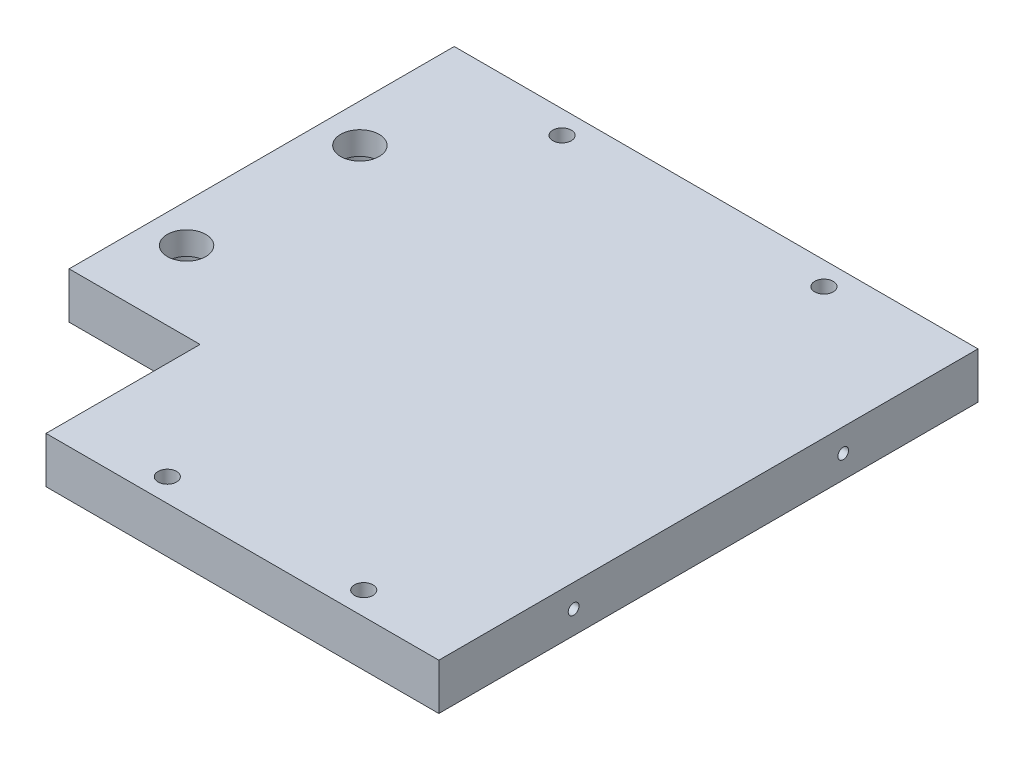
ISO-10303-21;
HEADER;
FILE_DESCRIPTION(('STEP AP214'),'2;1');
FILE_NAME('part.step','',(''),(''),'','','');
FILE_SCHEMA(('AUTOMOTIVE_DESIGN { 1 0 10303 214 1 1 1 1 }'));
ENDSEC;
DATA;
#1=APPLICATION_CONTEXT('core data for automotive mechanical design processes');
#2=APPLICATION_PROTOCOL_DEFINITION('international standard','automotive_design',2000,#1);
#3=PRODUCT_CONTEXT('',#1,'mechanical');
#4=PRODUCT('Part','Part','',(#3));
#5=PRODUCT_RELATED_PRODUCT_CATEGORY('part','',(#4));
#6=PRODUCT_DEFINITION_FORMATION('','',#4);
#7=PRODUCT_DEFINITION_CONTEXT('part definition',#1,'design');
#8=PRODUCT_DEFINITION('design','',#6,#7);
#9=PRODUCT_DEFINITION_SHAPE('','',#8);
#10=(LENGTH_UNIT() NAMED_UNIT(*) SI_UNIT(.MILLI.,.METRE.));
#11=(NAMED_UNIT(*) PLANE_ANGLE_UNIT() SI_UNIT($,.RADIAN.));
#12=(NAMED_UNIT(*) SI_UNIT($,.STERADIAN.) SOLID_ANGLE_UNIT());
#13=UNCERTAINTY_MEASURE_WITH_UNIT(LENGTH_MEASURE(1.E-05),#10,'distance_accuracy_value','');
#14=(GEOMETRIC_REPRESENTATION_CONTEXT(3) GLOBAL_UNCERTAINTY_ASSIGNED_CONTEXT((#13)) GLOBAL_UNIT_ASSIGNED_CONTEXT((#10,
#11,#12)) REPRESENTATION_CONTEXT('',''));
#15=CARTESIAN_POINT('',(0.,0.,0.));
#16=DIRECTION('',(0.,0.,1.));
#17=DIRECTION('',(1.,0.,0.));
#18=AXIS2_PLACEMENT_3D('',#15,#16,#17);
#19=CARTESIAN_POINT('',(-14.4999999978489,3.,-3.87501470179975));
#20=DIRECTION('',(0.,-1.,0.));
#21=DIRECTION('',(0.,0.,-1.));
#22=AXIS2_PLACEMENT_3D('',#19,#20,#21);
#23=CYLINDRICAL_SURFACE('',#22,1.25);
#24=CARTESIAN_POINT('',(-14.4999999978489,3.,-3.87501470179975));
#25=DIRECTION('',(0.,-1.,0.));
#26=DIRECTION('',(0.,0.,-1.));
#27=AXIS2_PLACEMENT_3D('',#24,#25,#26);
#28=CIRCLE('',#27,1.25);
#29=CARTESIAN_POINT('',(-14.4999999978489,3.,-5.12501470179975));
#30=VERTEX_POINT('',#29);
#31=EDGE_CURVE('E107',#30,#30,#28,.T.);
#32=ORIENTED_EDGE('',*,*,#31,.F.);
#33=EDGE_LOOP('',(#32));
#34=FACE_BOUND('',#33,.T.);
#35=CARTESIAN_POINT('',(-14.4999999978489,1.5,-3.87501470179975));
#36=DIRECTION('',(0.,-1.,0.));
#37=DIRECTION('',(0.,0.,-1.));
#38=AXIS2_PLACEMENT_3D('',#35,#36,#37);
#39=CIRCLE('',#38,1.25);
#40=CARTESIAN_POINT('',(-14.4999999978489,1.5,-5.12501470179975));
#41=VERTEX_POINT('',#40);
#42=EDGE_CURVE('E43',#41,#41,#39,.F.);
#43=ORIENTED_EDGE('',*,*,#42,.F.);
#44=EDGE_LOOP('',(#43));
#45=FACE_BOUND('',#44,.T.);
#46=ADVANCED_FACE('F39',(#34,#45),#23,.F.);
#47=CARTESIAN_POINT('',(-8.50000000000002,3.,-11.));
#48=DIRECTION('',(0.,-1.,0.));
#49=DIRECTION('',(0.,0.,-1.));
#50=AXIS2_PLACEMENT_3D('',#47,#48,#49);
#51=CYLINDRICAL_SURFACE('',#50,0.6);
#52=CARTESIAN_POINT('',(-8.50000000000002,3.,-11.));
#53=DIRECTION('',(0.,-1.,0.));
#54=DIRECTION('',(0.,0.,-1.));
#55=AXIS2_PLACEMENT_3D('',#52,#53,#54);
#56=CIRCLE('',#55,0.6);
#57=CARTESIAN_POINT('',(-8.50000000000002,3.,-11.6));
#58=VERTEX_POINT('',#57);
#59=EDGE_CURVE('E130',#58,#58,#56,.T.);
#60=ORIENTED_EDGE('',*,*,#59,.F.);
#61=EDGE_LOOP('',(#60));
#62=FACE_BOUND('',#61,.T.);
#63=CARTESIAN_POINT('',(-8.50000000000002,1.5,-11.));
#64=DIRECTION('',(0.,-1.,0.));
#65=DIRECTION('',(0.,0.,-1.));
#66=AXIS2_PLACEMENT_3D('',#63,#64,#65);
#67=CIRCLE('',#66,0.6);
#68=CARTESIAN_POINT('',(-8.50000000000002,1.5,-11.6));
#69=VERTEX_POINT('',#68);
#70=EDGE_CURVE('E125',#69,#69,#67,.F.);
#71=ORIENTED_EDGE('',*,*,#70,.F.);
#72=EDGE_LOOP('',(#71));
#73=FACE_BOUND('',#72,.T.);
#74=ADVANCED_FACE('F211',(#62,#73),#51,.F.);
#75=CARTESIAN_POINT('',(-14.4999999978489,3.,7.37498529820025));
#76=DIRECTION('',(0.,-1.,0.));
#77=DIRECTION('',(0.,0.,-1.));
#78=AXIS2_PLACEMENT_3D('',#75,#76,#77);
#79=CYLINDRICAL_SURFACE('',#78,1.25);
#80=CARTESIAN_POINT('',(-14.4999999978489,3.,7.37498529820025));
#81=DIRECTION('',(0.,-1.,0.));
#82=DIRECTION('',(0.,0.,-1.));
#83=AXIS2_PLACEMENT_3D('',#80,#81,#82);
#84=CIRCLE('',#83,1.25);
#85=CARTESIAN_POINT('',(-14.4999999978489,3.,6.12498529820025));
#86=VERTEX_POINT('',#85);
#87=EDGE_CURVE('E148',#86,#86,#84,.T.);
#88=ORIENTED_EDGE('',*,*,#87,.F.);
#89=EDGE_LOOP('',(#88));
#90=FACE_BOUND('',#89,.T.);
#91=CARTESIAN_POINT('',(-14.4999999978489,1.5,7.37498529820025));
#92=DIRECTION('',(0.,-1.,0.));
#93=DIRECTION('',(0.,0.,-1.));
#94=AXIS2_PLACEMENT_3D('',#91,#92,#93);
#95=CIRCLE('',#94,1.25);
#96=CARTESIAN_POINT('',(-14.4999999978489,1.5,6.12498529820025));
#97=VERTEX_POINT('',#96);
#98=EDGE_CURVE('E123',#97,#97,#95,.F.);
#99=ORIENTED_EDGE('',*,*,#98,.F.);
#100=EDGE_LOOP('',(#99));
#101=FACE_BOUND('',#100,.T.);
#102=ADVANCED_FACE('F218',(#90,#101),#79,.F.);
#103=CARTESIAN_POINT('',(10.625,3.,21.));
#104=DIRECTION('',(0.,-1.,0.));
#105=DIRECTION('',(0.,0.,-1.));
#106=AXIS2_PLACEMENT_3D('',#103,#104,#105);
#107=CYLINDRICAL_SURFACE('',#106,0.6);
#108=CARTESIAN_POINT('',(10.625,3.,21.));
#109=DIRECTION('',(0.,-1.,0.));
#110=DIRECTION('',(0.,0.,-1.));
#111=AXIS2_PLACEMENT_3D('',#108,#109,#110);
#112=CIRCLE('',#111,0.6);
#113=CARTESIAN_POINT('',(10.625,3.,20.4));
#114=VERTEX_POINT('',#113);
#115=EDGE_CURVE('E146',#114,#114,#112,.T.);
#116=ORIENTED_EDGE('',*,*,#115,.F.);
#117=EDGE_LOOP('',(#116));
#118=FACE_BOUND('',#117,.T.);
#119=CARTESIAN_POINT('',(10.625,1.5,21.));
#120=DIRECTION('',(0.,-1.,0.));
#121=DIRECTION('',(0.,0.,-1.));
#122=AXIS2_PLACEMENT_3D('',#119,#120,#121);
#123=CIRCLE('',#122,0.6);
#124=CARTESIAN_POINT('',(10.625,1.5,20.4));
#125=VERTEX_POINT('',#124);
#126=EDGE_CURVE('E120',#125,#125,#123,.F.);
#127=ORIENTED_EDGE('',*,*,#126,.F.);
#128=EDGE_LOOP('',(#127));
#129=FACE_BOUND('',#128,.T.);
#130=ADVANCED_FACE('F224',(#118,#129),#107,.F.);
#131=CARTESIAN_POINT('',(-2.125,3.,21.));
#132=DIRECTION('',(0.,-1.,0.));
#133=DIRECTION('',(0.,0.,-1.));
#134=AXIS2_PLACEMENT_3D('',#131,#132,#133);
#135=CYLINDRICAL_SURFACE('',#134,0.6);
#136=CARTESIAN_POINT('',(-2.125,3.,21.));
#137=DIRECTION('',(0.,-1.,0.));
#138=DIRECTION('',(0.,0.,-1.));
#139=AXIS2_PLACEMENT_3D('',#136,#137,#138);
#140=CIRCLE('',#139,0.6);
#141=CARTESIAN_POINT('',(-2.125,3.,20.4));
#142=VERTEX_POINT('',#141);
#143=EDGE_CURVE('E139',#142,#142,#140,.T.);
#144=ORIENTED_EDGE('',*,*,#143,.F.);
#145=EDGE_LOOP('',(#144));
#146=FACE_BOUND('',#145,.T.);
#147=CARTESIAN_POINT('',(-2.125,1.5,21.));
#148=DIRECTION('',(0.,-1.,0.));
#149=DIRECTION('',(0.,0.,-1.));
#150=AXIS2_PLACEMENT_3D('',#147,#148,#149);
#151=CIRCLE('',#150,0.6);
#152=CARTESIAN_POINT('',(-2.125,1.5,20.4));
#153=VERTEX_POINT('',#152);
#154=EDGE_CURVE('E116',#153,#153,#151,.F.);
#155=ORIENTED_EDGE('',*,*,#154,.F.);
#156=EDGE_LOOP('',(#155));
#157=FACE_BOUND('',#156,.T.);
#158=ADVANCED_FACE('F237',(#146,#157),#135,.F.);
#159=CARTESIAN_POINT('',(8.49999999999999,3.,-11.));
#160=DIRECTION('',(0.,-1.,0.));
#161=DIRECTION('',(0.,0.,-1.));
#162=AXIS2_PLACEMENT_3D('',#159,#160,#161);
#163=CYLINDRICAL_SURFACE('',#162,0.6);
#164=CARTESIAN_POINT('',(8.49999999999999,3.,-11.));
#165=DIRECTION('',(0.,-1.,0.));
#166=DIRECTION('',(0.,0.,-1.));
#167=AXIS2_PLACEMENT_3D('',#164,#165,#166);
#168=CIRCLE('',#167,0.6);
#169=CARTESIAN_POINT('',(8.49999999999999,3.,-11.6));
#170=VERTEX_POINT('',#169);
#171=EDGE_CURVE('E134',#170,#170,#168,.T.);
#172=ORIENTED_EDGE('',*,*,#171,.F.);
#173=EDGE_LOOP('',(#172));
#174=FACE_BOUND('',#173,.T.);
#175=CARTESIAN_POINT('',(8.49999999999999,1.5,-11.));
#176=DIRECTION('',(0.,-1.,0.));
#177=DIRECTION('',(0.,0.,-1.));
#178=AXIS2_PLACEMENT_3D('',#175,#176,#177);
#179=CIRCLE('',#178,0.6);
#180=CARTESIAN_POINT('',(8.49999999999999,1.5,-11.6));
#181=VERTEX_POINT('',#180);
#182=EDGE_CURVE('E113',#181,#181,#179,.F.);
#183=ORIENTED_EDGE('',*,*,#182,.F.);
#184=EDGE_LOOP('',(#183));
#185=FACE_BOUND('',#184,.T.);
#186=ADVANCED_FACE('F232',(#174,#185),#163,.F.);
#187=CARTESIAN_POINT('',(-17.,3.,12.5));
#188=DIRECTION('',(0.,0.,-1.));
#189=DIRECTION('',(-1.,0.,0.));
#190=AXIS2_PLACEMENT_3D('',#187,#188,#189);
#191=PLANE('',#190);
#192=DIRECTION('',(0.,-1.,0.));
#193=VECTOR('',#192,1.);
#194=CARTESIAN_POINT('',(-8.5,3.,12.5));
#195=LINE('',#194,#193);
#196=CARTESIAN_POINT('',(-8.5,3.,12.5));
#197=VERTEX_POINT('',#196);
#198=CARTESIAN_POINT('',(-8.5,0.,12.5));
#199=VERTEX_POINT('',#198);
#200=EDGE_CURVE('E11',#197,#199,#195,.T.);
#201=ORIENTED_EDGE('',*,*,#200,.F.);
#202=DIRECTION('',(1.,0.,0.));
#203=VECTOR('',#202,1.);
#204=CARTESIAN_POINT('',(-17.,3.,12.5));
#205=LINE('',#204,#203);
#206=CARTESIAN_POINT('',(-17.,3.,12.5));
#207=VERTEX_POINT('',#206);
#208=EDGE_CURVE('E162',#207,#197,#205,.T.);
#209=ORIENTED_EDGE('',*,*,#208,.F.);
#210=DIRECTION('',(0.,-1.,0.));
#211=VECTOR('',#210,1.);
#212=CARTESIAN_POINT('',(-17.,3.,12.5));
#213=LINE('',#212,#211);
#214=CARTESIAN_POINT('',(-17.,0.,12.5));
#215=VERTEX_POINT('',#214);
#216=EDGE_CURVE('E49',#207,#215,#213,.T.);
#217=ORIENTED_EDGE('',*,*,#216,.T.);
#218=DIRECTION('',(1.,0.,0.));
#219=VECTOR('',#218,1.);
#220=CARTESIAN_POINT('',(-17.,0.,12.5));
#221=LINE('',#220,#219);
#222=EDGE_CURVE('E92',#215,#199,#221,.T.);
#223=ORIENTED_EDGE('',*,*,#222,.T.);
#224=EDGE_LOOP('',(#201,#209,#217,#223));
#225=FACE_BOUND('',#224,.T.);
#226=ADVANCED_FACE('F184',(#225),#191,.F.);
#227=CARTESIAN_POINT('',(-17.,3.,12.5));
#228=DIRECTION('',(-1.,0.,0.));
#229=DIRECTION('',(0.,0.,1.));
#230=AXIS2_PLACEMENT_3D('',#227,#228,#229);
#231=PLANE('',#230);
#232=DIRECTION('',(0.,0.,-1.));
#233=VECTOR('',#232,1.);
#234=CARTESIAN_POINT('',(-17.,0.,12.5));
#235=LINE('',#234,#233);
#236=CARTESIAN_POINT('',(-17.,0.,-12.5));
#237=VERTEX_POINT('',#236);
#238=EDGE_CURVE('E111',#215,#237,#235,.T.);
#239=ORIENTED_EDGE('',*,*,#238,.F.);
#240=ORIENTED_EDGE('',*,*,#216,.F.);
#241=DIRECTION('',(0.,0.,-1.));
#242=VECTOR('',#241,1.);
#243=CARTESIAN_POINT('',(-17.,3.,12.5));
#244=LINE('',#243,#242);
#245=CARTESIAN_POINT('',(-17.,3.,-12.5));
#246=VERTEX_POINT('',#245);
#247=EDGE_CURVE('E155',#207,#246,#244,.T.);
#248=ORIENTED_EDGE('',*,*,#247,.T.);
#249=DIRECTION('',(0.,-1.,0.));
#250=VECTOR('',#249,1.);
#251=CARTESIAN_POINT('',(-17.,3.,-12.5));
#252=LINE('',#251,#250);
#253=EDGE_CURVE('E165',#246,#237,#252,.T.);
#254=ORIENTED_EDGE('',*,*,#253,.T.);
#255=EDGE_LOOP('',(#239,#240,#248,#254));
#256=FACE_BOUND('',#255,.T.);
#257=ADVANCED_FACE('F188',(#256),#231,.T.);
#258=CARTESIAN_POINT('',(17.,3.,12.5));
#259=DIRECTION('',(-1.,0.,0.));
#260=DIRECTION('',(0.,0.,1.));
#261=AXIS2_PLACEMENT_3D('',#258,#259,#260);
#262=PLANE('',#261);
#263=CARTESIAN_POINT('',(17.,1.49999999999993,-3.74999999999997));
#264=DIRECTION('',(1.,0.,0.));
#265=DIRECTION('',(0.,0.,-1.));
#266=AXIS2_PLACEMENT_3D('',#263,#264,#265);
#267=CIRCLE('',#266,0.35);
#268=CARTESIAN_POINT('',(17.,1.49999999999993,-4.09999999999997));
#269=VERTEX_POINT('',#268);
#270=EDGE_CURVE('E563',#269,#269,#267,.T.);
#271=ORIENTED_EDGE('',*,*,#270,.F.);
#272=EDGE_LOOP('',(#271));
#273=FACE_BOUND('',#272,.T.);
#274=CARTESIAN_POINT('',(17.,1.49999999999993,13.75));
#275=DIRECTION('',(1.,0.,0.));
#276=DIRECTION('',(0.,0.,-1.));
#277=AXIS2_PLACEMENT_3D('',#274,#275,#276);
#278=CIRCLE('',#277,0.349999999999999);
#279=CARTESIAN_POINT('',(17.,1.49999999999993,13.4));
#280=VERTEX_POINT('',#279);
#281=EDGE_CURVE('E569',#280,#280,#278,.T.);
#282=ORIENTED_EDGE('',*,*,#281,.F.);
#283=EDGE_LOOP('',(#282));
#284=FACE_BOUND('',#283,.T.);
#285=DIRECTION('',(0.,0.,-1.));
#286=VECTOR('',#285,1.);
#287=CARTESIAN_POINT('',(17.,0.,12.5));
#288=LINE('',#287,#286);
#289=CARTESIAN_POINT('',(17.,0.,22.5));
#290=VERTEX_POINT('',#289);
#291=CARTESIAN_POINT('',(17.,0.,-12.5));
#292=VERTEX_POINT('',#291);
#293=EDGE_CURVE('E81',#290,#292,#288,.T.);
#294=ORIENTED_EDGE('',*,*,#293,.T.);
#295=DIRECTION('',(0.,-1.,0.));
#296=VECTOR('',#295,1.);
#297=CARTESIAN_POINT('',(17.,3.,-12.5));
#298=LINE('',#297,#296);
#299=CARTESIAN_POINT('',(17.,3.,-12.5));
#300=VERTEX_POINT('',#299);
#301=EDGE_CURVE('E171',#300,#292,#298,.T.);
#302=ORIENTED_EDGE('',*,*,#301,.F.);
#303=DIRECTION('',(0.,0.,-1.));
#304=VECTOR('',#303,1.);
#305=CARTESIAN_POINT('',(17.,3.,12.5));
#306=LINE('',#305,#304);
#307=CARTESIAN_POINT('',(17.,3.,22.5));
#308=VERTEX_POINT('',#307);
#309=EDGE_CURVE('E98',#308,#300,#306,.T.);
#310=ORIENTED_EDGE('',*,*,#309,.F.);
#311=DIRECTION('',(0.,-1.,0.));
#312=VECTOR('',#311,1.);
#313=CARTESIAN_POINT('',(17.,3.,22.5));
#314=LINE('',#313,#312);
#315=EDGE_CURVE('E95',#308,#290,#314,.T.);
#316=ORIENTED_EDGE('',*,*,#315,.T.);
#317=EDGE_LOOP('',(#294,#302,#310,#316));
#318=FACE_BOUND('',#317,.T.);
#319=ADVANCED_FACE('F96',(#273,#284,#318),#262,.F.);
#320=CARTESIAN_POINT('',(-17.,3.,-12.5));
#321=DIRECTION('',(0.,0.,-1.));
#322=DIRECTION('',(-1.,0.,0.));
#323=AXIS2_PLACEMENT_3D('',#320,#321,#322);
#324=PLANE('',#323);
#325=DIRECTION('',(1.,0.,0.));
#326=VECTOR('',#325,1.);
#327=CARTESIAN_POINT('',(-17.,0.,-12.5));
#328=LINE('',#327,#326);
#329=EDGE_CURVE('E89',#237,#292,#328,.T.);
#330=ORIENTED_EDGE('',*,*,#329,.F.);
#331=ORIENTED_EDGE('',*,*,#253,.F.);
#332=DIRECTION('',(1.,0.,0.));
#333=VECTOR('',#332,1.);
#334=CARTESIAN_POINT('',(-17.,3.,-12.5));
#335=LINE('',#334,#333);
#336=EDGE_CURVE('E158',#246,#300,#335,.T.);
#337=ORIENTED_EDGE('',*,*,#336,.T.);
#338=ORIENTED_EDGE('',*,*,#301,.T.);
#339=EDGE_LOOP('',(#330,#331,#337,#338));
#340=FACE_BOUND('',#339,.T.);
#341=ADVANCED_FACE('F195',(#340),#324,.T.);
#342=CARTESIAN_POINT('',(0.,3.,0.));
#343=DIRECTION('',(0.,-1.,0.));
#344=DIRECTION('',(0.,0.,-1.));
#345=AXIS2_PLACEMENT_3D('',#342,#343,#344);
#346=PLANE('',#345);
#347=ORIENTED_EDGE('',*,*,#171,.T.);
#348=EDGE_LOOP('',(#347));
#349=FACE_BOUND('',#348,.T.);
#350=ORIENTED_EDGE('',*,*,#143,.T.);
#351=EDGE_LOOP('',(#350));
#352=FACE_BOUND('',#351,.T.);
#353=ORIENTED_EDGE('',*,*,#115,.T.);
#354=EDGE_LOOP('',(#353));
#355=FACE_BOUND('',#354,.T.);
#356=ORIENTED_EDGE('',*,*,#87,.T.);
#357=EDGE_LOOP('',(#356));
#358=FACE_BOUND('',#357,.T.);
#359=ORIENTED_EDGE('',*,*,#59,.T.);
#360=EDGE_LOOP('',(#359));
#361=FACE_BOUND('',#360,.T.);
#362=ORIENTED_EDGE('',*,*,#31,.T.);
#363=EDGE_LOOP('',(#362));
#364=FACE_BOUND('',#363,.T.);
#365=ORIENTED_EDGE('',*,*,#247,.F.);
#366=ORIENTED_EDGE('',*,*,#208,.T.);
#367=DIRECTION('',(0.,0.,1.));
#368=VECTOR('',#367,1.);
#369=CARTESIAN_POINT('',(-8.5,3.,12.5));
#370=LINE('',#369,#368);
#371=CARTESIAN_POINT('',(-8.5,3.,22.5));
#372=VERTEX_POINT('',#371);
#373=EDGE_CURVE('E103',#197,#372,#370,.T.);
#374=ORIENTED_EDGE('',*,*,#373,.T.);
#375=DIRECTION('',(-1.,0.,0.));
#376=VECTOR('',#375,1.);
#377=CARTESIAN_POINT('',(17.,3.,22.5));
#378=LINE('',#377,#376);
#379=EDGE_CURVE('E100',#308,#372,#378,.T.);
#380=ORIENTED_EDGE('',*,*,#379,.F.);
#381=ORIENTED_EDGE('',*,*,#309,.T.);
#382=ORIENTED_EDGE('',*,*,#336,.F.);
#383=EDGE_LOOP('',(#365,#366,#374,#380,#381,#382));
#384=FACE_BOUND('',#383,.T.);
#385=ADVANCED_FACE('F177',(#349,#352,#355,#358,#361,#364,#384),#346,.F.);
#386=CARTESIAN_POINT('',(0.,0.,0.));
#387=DIRECTION('',(0.,-1.,0.));
#388=DIRECTION('',(0.,0.,-1.));
#389=AXIS2_PLACEMENT_3D('',#386,#387,#388);
#390=PLANE('',#389);
#391=CARTESIAN_POINT('',(8.49999999999999,0.,-11.));
#392=DIRECTION('',(0.,-1.,0.));
#393=DIRECTION('',(0.,0.,-1.));
#394=AXIS2_PLACEMENT_3D('',#391,#392,#393);
#395=CIRCLE('',#394,0.999999999999999);
#396=CARTESIAN_POINT('',(8.49999999999999,0.,-12.));
#397=VERTEX_POINT('',#396);
#398=EDGE_CURVE('E587',#397,#397,#395,.T.);
#399=ORIENTED_EDGE('',*,*,#398,.F.);
#400=EDGE_LOOP('',(#399));
#401=FACE_BOUND('',#400,.T.);
#402=CARTESIAN_POINT('',(-2.125,0.,21.));
#403=DIRECTION('',(0.,-1.,0.));
#404=DIRECTION('',(0.,0.,-1.));
#405=AXIS2_PLACEMENT_3D('',#402,#403,#404);
#406=CIRCLE('',#405,1.);
#407=CARTESIAN_POINT('',(-2.125,0.,20.));
#408=VERTEX_POINT('',#407);
#409=EDGE_CURVE('E580',#408,#408,#406,.T.);
#410=ORIENTED_EDGE('',*,*,#409,.F.);
#411=EDGE_LOOP('',(#410));
#412=FACE_BOUND('',#411,.T.);
#413=CARTESIAN_POINT('',(10.625,0.,21.));
#414=DIRECTION('',(0.,-1.,0.));
#415=DIRECTION('',(0.,0.,-1.));
#416=AXIS2_PLACEMENT_3D('',#413,#414,#415);
#417=CIRCLE('',#416,1.);
#418=CARTESIAN_POINT('',(10.625,0.,20.));
#419=VERTEX_POINT('',#418);
#420=EDGE_CURVE('E597',#419,#419,#417,.T.);
#421=ORIENTED_EDGE('',*,*,#420,.F.);
#422=EDGE_LOOP('',(#421));
#423=FACE_BOUND('',#422,.T.);
#424=CARTESIAN_POINT('',(-14.4999999978489,0.,-3.87501470179975));
#425=DIRECTION('',(0.,-1.,0.));
#426=DIRECTION('',(0.,0.,-1.));
#427=AXIS2_PLACEMENT_3D('',#424,#425,#426);
#428=CIRCLE('',#427,2.);
#429=CARTESIAN_POINT('',(-14.4999999978489,0.,-5.87501470179975));
#430=VERTEX_POINT('',#429);
#431=EDGE_CURVE('E591',#430,#430,#428,.T.);
#432=ORIENTED_EDGE('',*,*,#431,.F.);
#433=EDGE_LOOP('',(#432));
#434=FACE_BOUND('',#433,.T.);
#435=CARTESIAN_POINT('',(-8.50000000000002,0.,-11.));
#436=DIRECTION('',(0.,-1.,0.));
#437=DIRECTION('',(0.,0.,-1.));
#438=AXIS2_PLACEMENT_3D('',#435,#436,#437);
#439=CIRCLE('',#438,1.);
#440=CARTESIAN_POINT('',(-8.50000000000002,0.,-12.));
#441=VERTEX_POINT('',#440);
#442=EDGE_CURVE('E566',#441,#441,#439,.T.);
#443=ORIENTED_EDGE('',*,*,#442,.F.);
#444=EDGE_LOOP('',(#443));
#445=FACE_BOUND('',#444,.T.);
#446=CARTESIAN_POINT('',(-14.4999999978489,0.,7.37498529820025));
#447=DIRECTION('',(0.,-1.,0.));
#448=DIRECTION('',(0.,0.,-1.));
#449=AXIS2_PLACEMENT_3D('',#446,#447,#448);
#450=CIRCLE('',#449,2.);
#451=CARTESIAN_POINT('',(-14.4999999978489,0.,5.37498529820025));
#452=VERTEX_POINT('',#451);
#453=EDGE_CURVE('E143',#452,#452,#450,.T.);
#454=ORIENTED_EDGE('',*,*,#453,.F.);
#455=EDGE_LOOP('',(#454));
#456=FACE_BOUND('',#455,.T.);
#457=ORIENTED_EDGE('',*,*,#238,.T.);
#458=ORIENTED_EDGE('',*,*,#329,.T.);
#459=ORIENTED_EDGE('',*,*,#293,.F.);
#460=DIRECTION('',(-1.,0.,0.));
#461=VECTOR('',#460,1.);
#462=CARTESIAN_POINT('',(17.,0.,22.5));
#463=LINE('',#462,#461);
#464=CARTESIAN_POINT('',(-8.5,0.,22.5));
#465=VERTEX_POINT('',#464);
#466=EDGE_CURVE('E86',#290,#465,#463,.T.);
#467=ORIENTED_EDGE('',*,*,#466,.T.);
#468=DIRECTION('',(0.,0.,1.));
#469=VECTOR('',#468,1.);
#470=CARTESIAN_POINT('',(-8.5,0.,12.5));
#471=LINE('',#470,#469);
#472=EDGE_CURVE('E104',#199,#465,#471,.T.);
#473=ORIENTED_EDGE('',*,*,#472,.F.);
#474=ORIENTED_EDGE('',*,*,#222,.F.);
#475=EDGE_LOOP('',(#457,#458,#459,#467,#473,#474));
#476=FACE_BOUND('',#475,.T.);
#477=ADVANCED_FACE('F84',(#401,#412,#423,#434,#445,#456,#476),#390,.T.);
#478=CARTESIAN_POINT('',(17.,3.,22.5));
#479=DIRECTION('',(0.,0.,1.));
#480=DIRECTION('',(1.,0.,0.));
#481=AXIS2_PLACEMENT_3D('',#478,#479,#480);
#482=PLANE('',#481);
#483=ORIENTED_EDGE('',*,*,#466,.F.);
#484=ORIENTED_EDGE('',*,*,#315,.F.);
#485=ORIENTED_EDGE('',*,*,#379,.T.);
#486=DIRECTION('',(0.,-1.,0.));
#487=VECTOR('',#486,1.);
#488=CARTESIAN_POINT('',(-8.5,3.,22.5));
#489=LINE('',#488,#487);
#490=EDGE_CURVE('E74',#372,#465,#489,.T.);
#491=ORIENTED_EDGE('',*,*,#490,.T.);
#492=EDGE_LOOP('',(#483,#484,#485,#491));
#493=FACE_BOUND('',#492,.T.);
#494=ADVANCED_FACE('F102',(#493),#482,.T.);
#495=CARTESIAN_POINT('',(-8.5,3.,12.5));
#496=DIRECTION('',(1.,0.,0.));
#497=DIRECTION('',(0.,0.,-1.));
#498=AXIS2_PLACEMENT_3D('',#495,#496,#497);
#499=PLANE('',#498);
#500=ORIENTED_EDGE('',*,*,#472,.T.);
#501=ORIENTED_EDGE('',*,*,#490,.F.);
#502=ORIENTED_EDGE('',*,*,#373,.F.);
#503=ORIENTED_EDGE('',*,*,#200,.T.);
#504=EDGE_LOOP('',(#500,#501,#502,#503));
#505=FACE_BOUND('',#504,.T.);
#506=ADVANCED_FACE('F41',(#505),#499,.F.);
#507=CARTESIAN_POINT('',(8.49999999999999,1.5,-11.));
#508=DIRECTION('',(0.,-1.,0.));
#509=DIRECTION('',(0.,0.,-1.));
#510=AXIS2_PLACEMENT_3D('',#507,#508,#509);
#511=PLANE('',#510);
#512=CARTESIAN_POINT('',(8.49999999999999,1.5,-11.));
#513=DIRECTION('',(0.,-1.,0.));
#514=DIRECTION('',(0.,0.,-1.));
#515=AXIS2_PLACEMENT_3D('',#512,#513,#514);
#516=CIRCLE('',#515,0.999999999999999);
#517=CARTESIAN_POINT('',(8.49999999999999,1.5,-12.));
#518=VERTEX_POINT('',#517);
#519=EDGE_CURVE('E578',#518,#518,#516,.T.);
#520=ORIENTED_EDGE('',*,*,#519,.T.);
#521=EDGE_LOOP('',(#520));
#522=FACE_BOUND('',#521,.T.);
#523=ORIENTED_EDGE('',*,*,#182,.T.);
#524=EDGE_LOOP('',(#523));
#525=FACE_BOUND('',#524,.T.);
#526=ADVANCED_FACE('F230',(#522,#525),#511,.T.);
#527=CARTESIAN_POINT('',(8.49999999999999,1.5,-11.));
#528=DIRECTION('',(0.,-1.,0.));
#529=DIRECTION('',(0.,0.,-1.));
#530=AXIS2_PLACEMENT_3D('',#527,#528,#529);
#531=CYLINDRICAL_SURFACE('',#530,0.999999999999999);
#532=ORIENTED_EDGE('',*,*,#519,.F.);
#533=EDGE_LOOP('',(#532));
#534=FACE_BOUND('',#533,.T.);
#535=ORIENTED_EDGE('',*,*,#398,.T.);
#536=EDGE_LOOP('',(#535));
#537=FACE_BOUND('',#536,.T.);
#538=ADVANCED_FACE('F247',(#534,#537),#531,.F.);
#539=CARTESIAN_POINT('',(-2.125,1.5,21.));
#540=DIRECTION('',(0.,-1.,0.));
#541=DIRECTION('',(0.,0.,-1.));
#542=AXIS2_PLACEMENT_3D('',#539,#540,#541);
#543=PLANE('',#542);
#544=CARTESIAN_POINT('',(-2.125,1.5,21.));
#545=DIRECTION('',(0.,-1.,0.));
#546=DIRECTION('',(0.,0.,-1.));
#547=AXIS2_PLACEMENT_3D('',#544,#545,#546);
#548=CIRCLE('',#547,1.);
#549=CARTESIAN_POINT('',(-2.125,1.5,20.));
#550=VERTEX_POINT('',#549);
#551=EDGE_CURVE('E584',#550,#550,#548,.T.);
#552=ORIENTED_EDGE('',*,*,#551,.T.);
#553=EDGE_LOOP('',(#552));
#554=FACE_BOUND('',#553,.T.);
#555=ORIENTED_EDGE('',*,*,#154,.T.);
#556=EDGE_LOOP('',(#555));
#557=FACE_BOUND('',#556,.T.);
#558=ADVANCED_FACE('F253',(#554,#557),#543,.T.);
#559=CARTESIAN_POINT('',(-2.125,1.5,21.));
#560=DIRECTION('',(0.,-1.,0.));
#561=DIRECTION('',(0.,0.,-1.));
#562=AXIS2_PLACEMENT_3D('',#559,#560,#561);
#563=CYLINDRICAL_SURFACE('',#562,1.);
#564=ORIENTED_EDGE('',*,*,#551,.F.);
#565=EDGE_LOOP('',(#564));
#566=FACE_BOUND('',#565,.T.);
#567=ORIENTED_EDGE('',*,*,#409,.T.);
#568=EDGE_LOOP('',(#567));
#569=FACE_BOUND('',#568,.T.);
#570=ADVANCED_FACE('F278',(#566,#569),#563,.F.);
#571=CARTESIAN_POINT('',(10.625,1.5,21.));
#572=DIRECTION('',(0.,-1.,0.));
#573=DIRECTION('',(0.,0.,-1.));
#574=AXIS2_PLACEMENT_3D('',#571,#572,#573);
#575=PLANE('',#574);
#576=CARTESIAN_POINT('',(10.625,1.5,21.));
#577=DIRECTION('',(0.,-1.,0.));
#578=DIRECTION('',(0.,0.,-1.));
#579=AXIS2_PLACEMENT_3D('',#576,#577,#578);
#580=CIRCLE('',#579,1.);
#581=CARTESIAN_POINT('',(10.625,1.5,20.));
#582=VERTEX_POINT('',#581);
#583=EDGE_CURVE('E583',#582,#582,#580,.T.);
#584=ORIENTED_EDGE('',*,*,#583,.T.);
#585=EDGE_LOOP('',(#584));
#586=FACE_BOUND('',#585,.T.);
#587=ORIENTED_EDGE('',*,*,#126,.T.);
#588=EDGE_LOOP('',(#587));
#589=FACE_BOUND('',#588,.T.);
#590=ADVANCED_FACE('F274',(#586,#589),#575,.T.);
#591=CARTESIAN_POINT('',(10.625,1.5,21.));
#592=DIRECTION('',(0.,-1.,0.));
#593=DIRECTION('',(0.,0.,-1.));
#594=AXIS2_PLACEMENT_3D('',#591,#592,#593);
#595=CYLINDRICAL_SURFACE('',#594,1.);
#596=ORIENTED_EDGE('',*,*,#583,.F.);
#597=EDGE_LOOP('',(#596));
#598=FACE_BOUND('',#597,.T.);
#599=ORIENTED_EDGE('',*,*,#420,.T.);
#600=EDGE_LOOP('',(#599));
#601=FACE_BOUND('',#600,.T.);
#602=ADVANCED_FACE('F270',(#598,#601),#595,.F.);
#603=CARTESIAN_POINT('',(-14.4999999978489,1.5,7.37498529820025));
#604=DIRECTION('',(0.,-1.,0.));
#605=DIRECTION('',(0.,0.,-1.));
#606=AXIS2_PLACEMENT_3D('',#603,#604,#605);
#607=PLANE('',#606);
#608=CARTESIAN_POINT('',(-14.4999999978489,1.5,7.37498529820025));
#609=DIRECTION('',(0.,-1.,0.));
#610=DIRECTION('',(0.,0.,-1.));
#611=AXIS2_PLACEMENT_3D('',#608,#609,#610);
#612=CIRCLE('',#611,2.);
#613=CARTESIAN_POINT('',(-14.4999999978489,1.5,5.37498529820025));
#614=VERTEX_POINT('',#613);
#615=EDGE_CURVE('E117',#614,#614,#612,.T.);
#616=ORIENTED_EDGE('',*,*,#615,.T.);
#617=EDGE_LOOP('',(#616));
#618=FACE_BOUND('',#617,.T.);
#619=ORIENTED_EDGE('',*,*,#98,.T.);
#620=EDGE_LOOP('',(#619));
#621=FACE_BOUND('',#620,.T.);
#622=ADVANCED_FACE('F273',(#618,#621),#607,.T.);
#623=CARTESIAN_POINT('',(-14.4999999978489,1.5,7.37498529820025));
#624=DIRECTION('',(0.,-1.,0.));
#625=DIRECTION('',(0.,0.,-1.));
#626=AXIS2_PLACEMENT_3D('',#623,#624,#625);
#627=CYLINDRICAL_SURFACE('',#626,2.);
#628=ORIENTED_EDGE('',*,*,#615,.F.);
#629=EDGE_LOOP('',(#628));
#630=FACE_BOUND('',#629,.T.);
#631=ORIENTED_EDGE('',*,*,#453,.T.);
#632=EDGE_LOOP('',(#631));
#633=FACE_BOUND('',#632,.T.);
#634=ADVANCED_FACE('F282',(#630,#633),#627,.F.);
#635=CARTESIAN_POINT('',(-8.50000000000002,1.5,-11.));
#636=DIRECTION('',(0.,-1.,0.));
#637=DIRECTION('',(0.,0.,-1.));
#638=AXIS2_PLACEMENT_3D('',#635,#636,#637);
#639=PLANE('',#638);
#640=CARTESIAN_POINT('',(-8.50000000000002,1.5,-11.));
#641=DIRECTION('',(0.,-1.,0.));
#642=DIRECTION('',(0.,0.,-1.));
#643=AXIS2_PLACEMENT_3D('',#640,#641,#642);
#644=CIRCLE('',#643,1.);
#645=CARTESIAN_POINT('',(-8.50000000000002,1.5,-12.));
#646=VERTEX_POINT('',#645);
#647=EDGE_CURVE('E562',#646,#646,#644,.T.);
#648=ORIENTED_EDGE('',*,*,#647,.T.);
#649=EDGE_LOOP('',(#648));
#650=FACE_BOUND('',#649,.T.);
#651=ORIENTED_EDGE('',*,*,#70,.T.);
#652=EDGE_LOOP('',(#651));
#653=FACE_BOUND('',#652,.T.);
#654=ADVANCED_FACE('F285',(#650,#653),#639,.T.);
#655=CARTESIAN_POINT('',(-8.50000000000002,1.5,-11.));
#656=DIRECTION('',(0.,-1.,0.));
#657=DIRECTION('',(0.,0.,-1.));
#658=AXIS2_PLACEMENT_3D('',#655,#656,#657);
#659=CYLINDRICAL_SURFACE('',#658,1.);
#660=ORIENTED_EDGE('',*,*,#647,.F.);
#661=EDGE_LOOP('',(#660));
#662=FACE_BOUND('',#661,.T.);
#663=ORIENTED_EDGE('',*,*,#442,.T.);
#664=EDGE_LOOP('',(#663));
#665=FACE_BOUND('',#664,.T.);
#666=ADVANCED_FACE('F268',(#662,#665),#659,.F.);
#667=CARTESIAN_POINT('',(-14.4999999978489,1.5,-3.87501470179975));
#668=DIRECTION('',(0.,-1.,0.));
#669=DIRECTION('',(0.,0.,-1.));
#670=AXIS2_PLACEMENT_3D('',#667,#668,#669);
#671=PLANE('',#670);
#672=CARTESIAN_POINT('',(-14.4999999978489,1.5,-3.87501470179975));
#673=DIRECTION('',(0.,-1.,0.));
#674=DIRECTION('',(0.,0.,-1.));
#675=AXIS2_PLACEMENT_3D('',#672,#673,#674);
#676=CIRCLE('',#675,2.);
#677=CARTESIAN_POINT('',(-14.4999999978489,1.5,-5.87501470179975));
#678=VERTEX_POINT('',#677);
#679=EDGE_CURVE('E594',#678,#678,#676,.T.);
#680=ORIENTED_EDGE('',*,*,#679,.T.);
#681=EDGE_LOOP('',(#680));
#682=FACE_BOUND('',#681,.T.);
#683=ORIENTED_EDGE('',*,*,#42,.T.);
#684=EDGE_LOOP('',(#683));
#685=FACE_BOUND('',#684,.T.);
#686=ADVANCED_FACE('F264',(#682,#685),#671,.T.);
#687=CARTESIAN_POINT('',(-14.4999999978489,1.5,-3.87501470179975));
#688=DIRECTION('',(0.,-1.,0.));
#689=DIRECTION('',(0.,0.,-1.));
#690=AXIS2_PLACEMENT_3D('',#687,#688,#689);
#691=CYLINDRICAL_SURFACE('',#690,2.);
#692=ORIENTED_EDGE('',*,*,#679,.F.);
#693=EDGE_LOOP('',(#692));
#694=FACE_BOUND('',#693,.T.);
#695=ORIENTED_EDGE('',*,*,#431,.T.);
#696=EDGE_LOOP('',(#695));
#697=FACE_BOUND('',#696,.T.);
#698=ADVANCED_FACE('F260',(#694,#697),#691,.F.);
#699=CARTESIAN_POINT('',(14.,1.49999999999993,13.75));
#700=DIRECTION('',(1.,0.,0.));
#701=DIRECTION('',(0.,0.,-1.));
#702=AXIS2_PLACEMENT_3D('',#699,#700,#701);
#703=CYLINDRICAL_SURFACE('',#702,0.349999999999999);
#704=CARTESIAN_POINT('',(14.,1.49999999999993,13.75));
#705=DIRECTION('',(1.,0.,0.));
#706=DIRECTION('',(0.,0.,-1.));
#707=AXIS2_PLACEMENT_3D('',#704,#705,#706);
#708=CIRCLE('',#707,0.349999999999999);
#709=CARTESIAN_POINT('',(14.,1.49999999999993,13.4));
#710=VERTEX_POINT('',#709);
#711=EDGE_CURVE('E574',#710,#710,#708,.T.);
#712=ORIENTED_EDGE('',*,*,#711,.F.);
#713=EDGE_LOOP('',(#712));
#714=FACE_BOUND('',#713,.T.);
#715=ORIENTED_EDGE('',*,*,#281,.T.);
#716=EDGE_LOOP('',(#715));
#717=FACE_BOUND('',#716,.T.);
#718=ADVANCED_FACE('F263',(#714,#717),#703,.F.);
#719=CARTESIAN_POINT('',(14.,1.49999999999993,13.75));
#720=DIRECTION('',(1.,0.,0.));
#721=DIRECTION('',(0.,0.,-1.));
#722=AXIS2_PLACEMENT_3D('',#719,#720,#721);
#723=PLANE('',#722);
#724=ORIENTED_EDGE('',*,*,#711,.T.);
#725=EDGE_LOOP('',(#724));
#726=FACE_BOUND('',#725,.T.);
#727=ADVANCED_FACE('F427',(#726),#723,.T.);
#728=CARTESIAN_POINT('',(14.,1.49999999999993,-3.74999999999997));
#729=DIRECTION('',(1.,0.,0.));
#730=DIRECTION('',(0.,0.,-1.));
#731=AXIS2_PLACEMENT_3D('',#728,#729,#730);
#732=CYLINDRICAL_SURFACE('',#731,0.35);
#733=CARTESIAN_POINT('',(14.,1.49999999999993,-3.74999999999997));
#734=DIRECTION('',(1.,0.,0.));
#735=DIRECTION('',(0.,0.,-1.));
#736=AXIS2_PLACEMENT_3D('',#733,#734,#735);
#737=CIRCLE('',#736,0.35);
#738=CARTESIAN_POINT('',(14.,1.49999999999993,-4.09999999999997));
#739=VERTEX_POINT('',#738);
#740=EDGE_CURVE('E561',#739,#739,#737,.T.);
#741=ORIENTED_EDGE('',*,*,#740,.F.);
#742=EDGE_LOOP('',(#741));
#743=FACE_BOUND('',#742,.T.);
#744=ORIENTED_EDGE('',*,*,#270,.T.);
#745=EDGE_LOOP('',(#744));
#746=FACE_BOUND('',#745,.T.);
#747=ADVANCED_FACE('F438',(#743,#746),#732,.F.);
#748=CARTESIAN_POINT('',(14.,1.49999999999993,-3.74999999999997));
#749=DIRECTION('',(1.,0.,0.));
#750=DIRECTION('',(0.,0.,-1.));
#751=AXIS2_PLACEMENT_3D('',#748,#749,#750);
#752=PLANE('',#751);
#753=ORIENTED_EDGE('',*,*,#740,.T.);
#754=EDGE_LOOP('',(#753));
#755=FACE_BOUND('',#754,.T.);
#756=ADVANCED_FACE('F449',(#755),#752,.T.);
#757=CLOSED_SHELL('',(#46,#74,#102,#130,#158,#186,#226,#257,#319,#341,#385,#477,#494,#506,#526,
#538,#558,#570,#590,#602,#622,#634,#654,#666,#686,#698,#718,#727,#747,#756));
#758=MANIFOLD_SOLID_BREP('B2',#757);
#759=ADVANCED_BREP_SHAPE_REPRESENTATION('',(#18,#758),#14);
#760=SHAPE_DEFINITION_REPRESENTATION(#9,#759);
ENDSEC;
END-ISO-10303-21;
